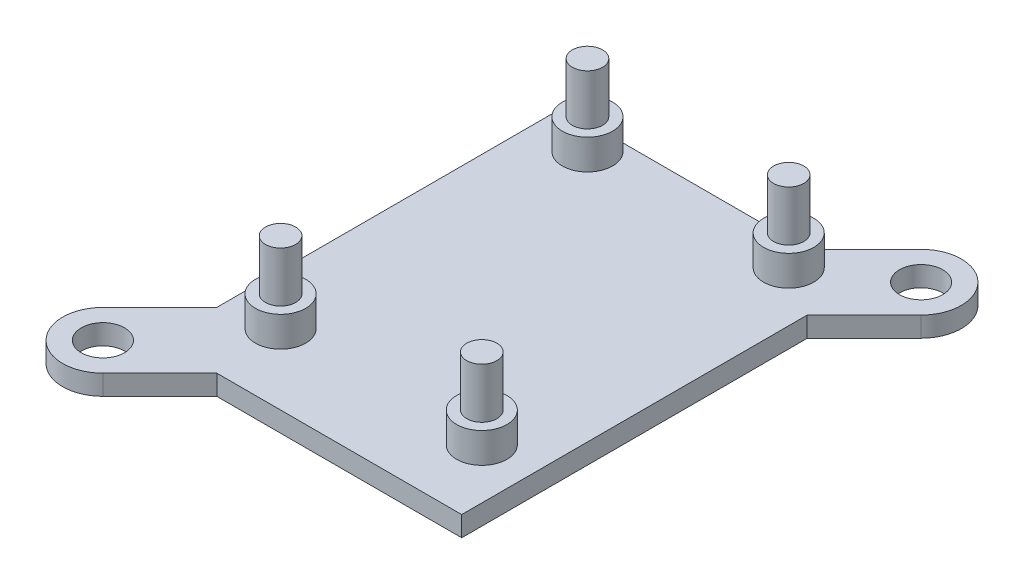
ISO-10303-21;
HEADER;
FILE_DESCRIPTION(('STEP AP214'),'2;1');
FILE_NAME('part.step','',(''),(''),'','','');
FILE_SCHEMA(('AUTOMOTIVE_DESIGN { 1 0 10303 214 1 1 1 1 }'));
ENDSEC;
DATA;
#1=APPLICATION_CONTEXT('core data for automotive mechanical design processes');
#2=APPLICATION_PROTOCOL_DEFINITION('international standard','automotive_design',2000,#1);
#3=PRODUCT_CONTEXT('',#1,'mechanical');
#4=PRODUCT('Part','Part','',(#3));
#5=PRODUCT_RELATED_PRODUCT_CATEGORY('part','',(#4));
#6=PRODUCT_DEFINITION_FORMATION('','',#4);
#7=PRODUCT_DEFINITION_CONTEXT('part definition',#1,'design');
#8=PRODUCT_DEFINITION('design','',#6,#7);
#9=PRODUCT_DEFINITION_SHAPE('','',#8);
#10=(LENGTH_UNIT() NAMED_UNIT(*) SI_UNIT(.MILLI.,.METRE.));
#11=(NAMED_UNIT(*) PLANE_ANGLE_UNIT() SI_UNIT($,.RADIAN.));
#12=(NAMED_UNIT(*) SI_UNIT($,.STERADIAN.) SOLID_ANGLE_UNIT());
#13=UNCERTAINTY_MEASURE_WITH_UNIT(LENGTH_MEASURE(1.E-05),#10,'distance_accuracy_value','');
#14=(GEOMETRIC_REPRESENTATION_CONTEXT(3) GLOBAL_UNCERTAINTY_ASSIGNED_CONTEXT((#13)) GLOBAL_UNIT_ASSIGNED_CONTEXT((#10,
#11,#12)) REPRESENTATION_CONTEXT('',''));
#15=CARTESIAN_POINT('',(0.,0.,0.));
#16=DIRECTION('',(0.,0.,1.));
#17=DIRECTION('',(1.,0.,0.));
#18=AXIS2_PLACEMENT_3D('',#15,#16,#17);
#19=CARTESIAN_POINT('',(0.,2.,0.));
#20=DIRECTION('',(-1.,0.,0.));
#21=DIRECTION('',(0.,0.,1.));
#22=AXIS2_PLACEMENT_3D('',#19,#20,#21);
#23=PLANE('',#22);
#24=DIRECTION('',(0.,0.,-1.));
#25=VECTOR('',#24,1.);
#26=CARTESIAN_POINT('',(0.,0.,0.));
#27=LINE('',#26,#25);
#28=CARTESIAN_POINT('',(0.,0.,34.3431457505076));
#29=VERTEX_POINT('',#28);
#30=CARTESIAN_POINT('',(0.,0.,0.));
#31=VERTEX_POINT('',#30);
#32=EDGE_CURVE('E180',#29,#31,#27,.T.);
#33=ORIENTED_EDGE('',*,*,#32,.F.);
#34=DIRECTION('',(0.,-1.,0.));
#35=VECTOR('',#34,1.);
#36=CARTESIAN_POINT('',(0.,2.,34.3431457505076));
#37=LINE('',#36,#35);
#38=CARTESIAN_POINT('',(0.,2.,34.3431457505076));
#39=VERTEX_POINT('',#38);
#40=EDGE_CURVE('E11',#39,#29,#37,.T.);
#41=ORIENTED_EDGE('',*,*,#40,.F.);
#42=DIRECTION('',(0.,0.,-1.));
#43=VECTOR('',#42,1.);
#44=CARTESIAN_POINT('',(0.,2.,0.));
#45=LINE('',#44,#43);
#46=CARTESIAN_POINT('',(0.,2.,0.));
#47=VERTEX_POINT('',#46);
#48=EDGE_CURVE('E223',#39,#47,#45,.T.);
#49=ORIENTED_EDGE('',*,*,#48,.T.);
#50=DIRECTION('',(0.,-1.,0.));
#51=VECTOR('',#50,1.);
#52=CARTESIAN_POINT('',(0.,2.,0.));
#53=LINE('',#52,#51);
#54=EDGE_CURVE('E70',#47,#31,#53,.T.);
#55=ORIENTED_EDGE('',*,*,#54,.T.);
#56=EDGE_LOOP('',(#33,#41,#49,#55));
#57=FACE_BOUND('',#56,.T.);
#58=ADVANCED_FACE('F47',(#57),#23,.T.);
#59=CARTESIAN_POINT('',(17.1715728752538,2.,17.1715728752535));
#60=DIRECTION('',(-0.707106781186552,0.,-0.707106781186543));
#61=DIRECTION('',(-0.707106781186543,0.,0.707106781186552));
#62=AXIS2_PLACEMENT_3D('',#59,#60,#61);
#63=PLANE('',#62);
#64=DIRECTION('',(0.707106781186543,0.,-0.707106781186552));
#65=VECTOR('',#64,1.);
#66=CARTESIAN_POINT('',(17.1715728752538,0.,17.1715728752535));
#67=LINE('',#66,#65);
#68=CARTESIAN_POINT('',(-5.65685424949238,0.,40.));
#69=VERTEX_POINT('',#68);
#70=EDGE_CURVE('E183',#69,#29,#67,.T.);
#71=ORIENTED_EDGE('',*,*,#70,.F.);
#72=DIRECTION('',(0.,-1.,0.));
#73=VECTOR('',#72,1.);
#74=CARTESIAN_POINT('',(-5.65685424949238,2.,40.));
#75=LINE('',#74,#73);
#76=CARTESIAN_POINT('',(-5.65685424949238,2.,40.));
#77=VERTEX_POINT('',#76);
#78=EDGE_CURVE('E56',#77,#69,#75,.T.);
#79=ORIENTED_EDGE('',*,*,#78,.F.);
#80=DIRECTION('',(0.707106781186543,0.,-0.707106781186552));
#81=VECTOR('',#80,1.);
#82=CARTESIAN_POINT('',(17.1715728752538,2.,17.1715728752535));
#83=LINE('',#82,#81);
#84=EDGE_CURVE('E297',#77,#39,#83,.T.);
#85=ORIENTED_EDGE('',*,*,#84,.T.);
#86=ORIENTED_EDGE('',*,*,#40,.T.);
#87=EDGE_LOOP('',(#71,#79,#85,#86));
#88=FACE_BOUND('',#87,.T.);
#89=ADVANCED_FACE('F328',(#88),#63,.T.);
#90=CARTESIAN_POINT('',(-2.82842712474619,2.,42.8284271247462));
#91=DIRECTION('',(0.,-1.,0.));
#92=DIRECTION('',(0.,0.,-1.));
#93=AXIS2_PLACEMENT_3D('',#90,#91,#92);
#94=CYLINDRICAL_SURFACE('',#93,4.);
#95=CARTESIAN_POINT('',(-2.82842712474619,0.,42.8284271247462));
#96=DIRECTION('',(0.,1.,0.));
#97=DIRECTION('',(0.,0.,1.));
#98=AXIS2_PLACEMENT_3D('',#95,#96,#97);
#99=CIRCLE('',#98,4.);
#100=CARTESIAN_POINT('',(0.,0.,45.6568542494924));
#101=VERTEX_POINT('',#100);
#102=EDGE_CURVE('E188',#69,#101,#99,.T.);
#103=ORIENTED_EDGE('',*,*,#102,.T.);
#104=DIRECTION('',(0.,-1.,0.));
#105=VECTOR('',#104,1.);
#106=CARTESIAN_POINT('',(0.,2.,45.6568542494924));
#107=LINE('',#106,#105);
#108=CARTESIAN_POINT('',(0.,2.,45.6568542494924));
#109=VERTEX_POINT('',#108);
#110=EDGE_CURVE('E239',#109,#101,#107,.T.);
#111=ORIENTED_EDGE('',*,*,#110,.F.);
#112=CARTESIAN_POINT('',(-2.82842712474619,2.,42.8284271247462));
#113=DIRECTION('',(0.,1.,0.));
#114=DIRECTION('',(0.,0.,1.));
#115=AXIS2_PLACEMENT_3D('',#112,#113,#114);
#116=CIRCLE('',#115,4.);
#117=EDGE_CURVE('E301',#77,#109,#116,.T.);
#118=ORIENTED_EDGE('',*,*,#117,.F.);
#119=ORIENTED_EDGE('',*,*,#78,.T.);
#120=EDGE_LOOP('',(#103,#111,#118,#119));
#121=FACE_BOUND('',#120,.T.);
#122=ADVANCED_FACE('F333',(#121),#94,.T.);
#123=CARTESIAN_POINT('',(22.8284271247462,2.,22.8284271247463));
#124=DIRECTION('',(-0.707106781186546,0.,-0.707106781186549));
#125=DIRECTION('',(-0.707106781186549,0.,0.707106781186546));
#126=AXIS2_PLACEMENT_3D('',#123,#124,#125);
#127=PLANE('',#126);
#128=DIRECTION('',(0.707106781186549,0.,-0.707106781186546));
#129=VECTOR('',#128,1.);
#130=CARTESIAN_POINT('',(22.8284271247462,0.,22.8284271247463));
#131=LINE('',#130,#129);
#132=CARTESIAN_POINT('',(5.65685424949242,0.,40.));
#133=VERTEX_POINT('',#132);
#134=EDGE_CURVE('E191',#101,#133,#131,.T.);
#135=ORIENTED_EDGE('',*,*,#134,.T.);
#136=DIRECTION('',(0.,-1.,0.));
#137=VECTOR('',#136,1.);
#138=CARTESIAN_POINT('',(5.65685424949242,2.,40.));
#139=LINE('',#138,#137);
#140=CARTESIAN_POINT('',(5.65685424949242,2.,40.));
#141=VERTEX_POINT('',#140);
#142=EDGE_CURVE('E236',#141,#133,#139,.T.);
#143=ORIENTED_EDGE('',*,*,#142,.F.);
#144=DIRECTION('',(0.707106781186549,0.,-0.707106781186546));
#145=VECTOR('',#144,1.);
#146=CARTESIAN_POINT('',(22.8284271247462,2.,22.8284271247463));
#147=LINE('',#146,#145);
#148=EDGE_CURVE('E304',#109,#141,#147,.T.);
#149=ORIENTED_EDGE('',*,*,#148,.F.);
#150=ORIENTED_EDGE('',*,*,#110,.T.);
#151=EDGE_LOOP('',(#135,#143,#149,#150));
#152=FACE_BOUND('',#151,.T.);
#153=ADVANCED_FACE('F337',(#152),#127,.F.);
#154=CARTESIAN_POINT('',(0.,2.,40.));
#155=DIRECTION('',(0.,0.,1.));
#156=DIRECTION('',(1.,0.,0.));
#157=AXIS2_PLACEMENT_3D('',#154,#155,#156);
#158=PLANE('',#157);
#159=DIRECTION('',(-1.,0.,0.));
#160=VECTOR('',#159,1.);
#161=CARTESIAN_POINT('',(0.,0.,40.));
#162=LINE('',#161,#160);
#163=CARTESIAN_POINT('',(30.,0.,40.));
#164=VERTEX_POINT('',#163);
#165=EDGE_CURVE('E195',#164,#133,#162,.T.);
#166=ORIENTED_EDGE('',*,*,#165,.F.);
#167=DIRECTION('',(0.,-1.,0.));
#168=VECTOR('',#167,1.);
#169=CARTESIAN_POINT('',(30.,2.,40.));
#170=LINE('',#169,#168);
#171=CARTESIAN_POINT('',(30.,2.,40.));
#172=VERTEX_POINT('',#171);
#173=EDGE_CURVE('E233',#172,#164,#170,.T.);
#174=ORIENTED_EDGE('',*,*,#173,.F.);
#175=DIRECTION('',(-1.,0.,0.));
#176=VECTOR('',#175,1.);
#177=CARTESIAN_POINT('',(0.,2.,40.));
#178=LINE('',#177,#176);
#179=EDGE_CURVE('E307',#172,#141,#178,.T.);
#180=ORIENTED_EDGE('',*,*,#179,.T.);
#181=ORIENTED_EDGE('',*,*,#142,.T.);
#182=EDGE_LOOP('',(#166,#174,#180,#181));
#183=FACE_BOUND('',#182,.T.);
#184=ADVANCED_FACE('F340',(#183),#158,.T.);
#185=CARTESIAN_POINT('',(30.,2.,0.));
#186=DIRECTION('',(1.,0.,0.));
#187=DIRECTION('',(0.,0.,-1.));
#188=AXIS2_PLACEMENT_3D('',#185,#186,#187);
#189=PLANE('',#188);
#190=DIRECTION('',(0.,0.,1.));
#191=VECTOR('',#190,1.);
#192=CARTESIAN_POINT('',(30.,0.,0.));
#193=LINE('',#192,#191);
#194=CARTESIAN_POINT('',(30.,0.,5.6568542494922));
#195=VERTEX_POINT('',#194);
#196=EDGE_CURVE('E199',#195,#164,#193,.T.);
#197=ORIENTED_EDGE('',*,*,#196,.F.);
#198=DIRECTION('',(0.,-1.,0.));
#199=VECTOR('',#198,1.);
#200=CARTESIAN_POINT('',(30.,2.,5.6568542494922));
#201=LINE('',#200,#199);
#202=CARTESIAN_POINT('',(30.,2.,5.6568542494922));
#203=VERTEX_POINT('',#202);
#204=EDGE_CURVE('E230',#203,#195,#201,.T.);
#205=ORIENTED_EDGE('',*,*,#204,.F.);
#206=DIRECTION('',(0.,0.,1.));
#207=VECTOR('',#206,1.);
#208=CARTESIAN_POINT('',(30.,2.,0.));
#209=LINE('',#208,#207);
#210=EDGE_CURVE('E165',#203,#172,#209,.T.);
#211=ORIENTED_EDGE('',*,*,#210,.T.);
#212=ORIENTED_EDGE('',*,*,#173,.T.);
#213=EDGE_LOOP('',(#197,#205,#211,#212));
#214=FACE_BOUND('',#213,.T.);
#215=ADVANCED_FACE('F314',(#214),#189,.T.);
#216=CARTESIAN_POINT('',(17.8284271247457,2.,17.8284271247462));
#217=DIRECTION('',(0.707106781186537,0.,0.707106781186558));
#218=DIRECTION('',(0.707106781186558,0.,-0.707106781186537));
#219=AXIS2_PLACEMENT_3D('',#216,#217,#218);
#220=PLANE('',#219);
#221=DIRECTION('',(-0.707106781186558,0.,0.707106781186537));
#222=VECTOR('',#221,1.);
#223=CARTESIAN_POINT('',(17.8284271247457,0.,17.8284271247462));
#224=LINE('',#223,#222);
#225=CARTESIAN_POINT('',(35.6568542494924,0.,0.));
#226=VERTEX_POINT('',#225);
#227=EDGE_CURVE('E203',#226,#195,#224,.T.);
#228=ORIENTED_EDGE('',*,*,#227,.F.);
#229=DIRECTION('',(0.,-1.,0.));
#230=VECTOR('',#229,1.);
#231=CARTESIAN_POINT('',(35.6568542494924,2.,0.));
#232=LINE('',#231,#230);
#233=CARTESIAN_POINT('',(35.6568542494924,2.,0.));
#234=VERTEX_POINT('',#233);
#235=EDGE_CURVE('E143',#234,#226,#232,.T.);
#236=ORIENTED_EDGE('',*,*,#235,.F.);
#237=DIRECTION('',(-0.707106781186558,0.,0.707106781186537));
#238=VECTOR('',#237,1.);
#239=CARTESIAN_POINT('',(17.8284271247457,2.,17.8284271247462));
#240=LINE('',#239,#238);
#241=EDGE_CURVE('E161',#234,#203,#240,.T.);
#242=ORIENTED_EDGE('',*,*,#241,.T.);
#243=ORIENTED_EDGE('',*,*,#204,.T.);
#244=EDGE_LOOP('',(#228,#236,#242,#243));
#245=FACE_BOUND('',#244,.T.);
#246=ADVANCED_FACE('F319',(#245),#220,.T.);
#247=CARTESIAN_POINT('',(32.8284271247462,2.,-2.82842712474619));
#248=DIRECTION('',(0.,-1.,0.));
#249=DIRECTION('',(0.,0.,-1.));
#250=AXIS2_PLACEMENT_3D('',#247,#248,#249);
#251=CYLINDRICAL_SURFACE('',#250,4.);
#252=CARTESIAN_POINT('',(32.8284271247462,0.,-2.82842712474619));
#253=DIRECTION('',(0.,1.,0.));
#254=DIRECTION('',(0.,0.,1.));
#255=AXIS2_PLACEMENT_3D('',#252,#253,#254);
#256=CIRCLE('',#255,4.);
#257=CARTESIAN_POINT('',(30.,0.,-5.65685424949238));
#258=VERTEX_POINT('',#257);
#259=EDGE_CURVE('E138',#258,#226,#256,.F.);
#260=ORIENTED_EDGE('',*,*,#259,.F.);
#261=DIRECTION('',(0.,-1.,0.));
#262=VECTOR('',#261,1.);
#263=CARTESIAN_POINT('',(30.,2.,-5.65685424949238));
#264=LINE('',#263,#262);
#265=CARTESIAN_POINT('',(30.,2.,-5.65685424949238));
#266=VERTEX_POINT('',#265);
#267=EDGE_CURVE('E132',#266,#258,#264,.T.);
#268=ORIENTED_EDGE('',*,*,#267,.F.);
#269=CARTESIAN_POINT('',(32.8284271247462,2.,-2.82842712474619));
#270=DIRECTION('',(0.,1.,0.));
#271=DIRECTION('',(0.,0.,1.));
#272=AXIS2_PLACEMENT_3D('',#269,#270,#271);
#273=CIRCLE('',#272,4.);
#274=EDGE_CURVE('E136',#266,#234,#273,.F.);
#275=ORIENTED_EDGE('',*,*,#274,.T.);
#276=ORIENTED_EDGE('',*,*,#235,.T.);
#277=EDGE_LOOP('',(#260,#268,#275,#276));
#278=FACE_BOUND('',#277,.T.);
#279=ADVANCED_FACE('F134',(#278),#251,.T.);
#280=CARTESIAN_POINT('',(12.171572875254,2.,12.1715728752539));
#281=DIRECTION('',(0.707106781186553,0.,0.707106781186542));
#282=DIRECTION('',(0.707106781186542,0.,-0.707106781186553));
#283=AXIS2_PLACEMENT_3D('',#280,#281,#282);
#284=PLANE('',#283);
#285=DIRECTION('',(-0.707106781186542,0.,0.707106781186553));
#286=VECTOR('',#285,1.);
#287=CARTESIAN_POINT('',(12.171572875254,0.,12.1715728752539));
#288=LINE('',#287,#286);
#289=CARTESIAN_POINT('',(24.3431457505077,0.,0.));
#290=VERTEX_POINT('',#289);
#291=EDGE_CURVE('E209',#258,#290,#288,.T.);
#292=ORIENTED_EDGE('',*,*,#291,.T.);
#293=DIRECTION('',(0.,-1.,0.));
#294=VECTOR('',#293,1.);
#295=CARTESIAN_POINT('',(24.3431457505077,2.,0.));
#296=LINE('',#295,#294);
#297=CARTESIAN_POINT('',(24.3431457505077,2.,0.));
#298=VERTEX_POINT('',#297);
#299=EDGE_CURVE('E144',#298,#290,#296,.T.);
#300=ORIENTED_EDGE('',*,*,#299,.F.);
#301=DIRECTION('',(-0.707106781186542,0.,0.707106781186553));
#302=VECTOR('',#301,1.);
#303=CARTESIAN_POINT('',(12.171572875254,2.,12.1715728752539));
#304=LINE('',#303,#302);
#305=EDGE_CURVE('E148',#266,#298,#304,.T.);
#306=ORIENTED_EDGE('',*,*,#305,.F.);
#307=ORIENTED_EDGE('',*,*,#267,.T.);
#308=EDGE_LOOP('',(#292,#300,#306,#307));
#309=FACE_BOUND('',#308,.T.);
#310=ADVANCED_FACE('F149',(#309),#284,.F.);
#311=CARTESIAN_POINT('',(32.8284271247462,2.,-2.82842712474619));
#312=DIRECTION('',(0.,-1.,0.));
#313=DIRECTION('',(0.,0.,-1.));
#314=AXIS2_PLACEMENT_3D('',#311,#312,#313);
#315=CYLINDRICAL_SURFACE('',#314,2.15);
#316=CARTESIAN_POINT('',(32.8284271247462,2.,-2.82842712474619));
#317=DIRECTION('',(0.,1.,0.));
#318=DIRECTION('',(0.,0.,1.));
#319=AXIS2_PLACEMENT_3D('',#316,#317,#318);
#320=CIRCLE('',#319,2.15);
#321=CARTESIAN_POINT('',(32.8284271247462,2.,-0.678427124746188));
#322=VERTEX_POINT('',#321);
#323=EDGE_CURVE('E172',#322,#322,#320,.T.);
#324=ORIENTED_EDGE('',*,*,#323,.T.);
#325=EDGE_LOOP('',(#324));
#326=FACE_BOUND('',#325,.T.);
#327=CARTESIAN_POINT('',(32.8284271247462,0.,-2.82842712474619));
#328=DIRECTION('',(0.,1.,0.));
#329=DIRECTION('',(0.,0.,1.));
#330=AXIS2_PLACEMENT_3D('',#327,#328,#329);
#331=CIRCLE('',#330,2.15);
#332=CARTESIAN_POINT('',(32.8284271247462,0.,-0.678427124746188));
#333=VERTEX_POINT('',#332);
#334=EDGE_CURVE('E215',#333,#333,#331,.T.);
#335=ORIENTED_EDGE('',*,*,#334,.F.);
#336=EDGE_LOOP('',(#335));
#337=FACE_BOUND('',#336,.T.);
#338=ADVANCED_FACE('F400',(#326,#337),#315,.F.);
#339=CARTESIAN_POINT('',(0.,2.,0.));
#340=DIRECTION('',(0.,0.,-1.));
#341=DIRECTION('',(-1.,0.,0.));
#342=AXIS2_PLACEMENT_3D('',#339,#340,#341);
#343=PLANE('',#342);
#344=DIRECTION('',(1.,0.,0.));
#345=VECTOR('',#344,1.);
#346=CARTESIAN_POINT('',(0.,2.,0.));
#347=LINE('',#346,#345);
#348=CARTESIAN_POINT('',(5.,2.,0.));
#349=VERTEX_POINT('',#348);
#350=EDGE_CURVE('E169',#47,#349,#347,.T.);
#351=ORIENTED_EDGE('',*,*,#350,.T.);
#352=EDGE_CURVE('E154',#349,#298,#347,.T.);
#353=ORIENTED_EDGE('',*,*,#352,.T.);
#354=ORIENTED_EDGE('',*,*,#299,.T.);
#355=DIRECTION('',(1.,0.,0.));
#356=VECTOR('',#355,1.);
#357=CARTESIAN_POINT('',(0.,0.,0.));
#358=LINE('',#357,#356);
#359=EDGE_CURVE('E212',#31,#290,#358,.T.);
#360=ORIENTED_EDGE('',*,*,#359,.F.);
#361=ORIENTED_EDGE('',*,*,#54,.F.);
#362=EDGE_LOOP('',(#351,#353,#354,#360,#361));
#363=FACE_BOUND('',#362,.T.);
#364=ADVANCED_FACE('F323',(#363),#343,.T.);
#365=CARTESIAN_POINT('',(-2.82842712474619,2.,42.8284271247462));
#366=DIRECTION('',(0.,-1.,0.));
#367=DIRECTION('',(0.,0.,-1.));
#368=AXIS2_PLACEMENT_3D('',#365,#366,#367);
#369=CYLINDRICAL_SURFACE('',#368,2.15);
#370=CARTESIAN_POINT('',(-2.82842712474619,2.,42.8284271247462));
#371=DIRECTION('',(0.,1.,0.));
#372=DIRECTION('',(0.,0.,1.));
#373=AXIS2_PLACEMENT_3D('',#370,#371,#372);
#374=CIRCLE('',#373,2.15);
#375=CARTESIAN_POINT('',(-2.82842712474619,2.,44.9784271247462));
#376=VERTEX_POINT('',#375);
#377=EDGE_CURVE('E176',#376,#376,#374,.T.);
#378=ORIENTED_EDGE('',*,*,#377,.T.);
#379=EDGE_LOOP('',(#378));
#380=FACE_BOUND('',#379,.T.);
#381=CARTESIAN_POINT('',(-2.82842712474619,0.,42.8284271247462));
#382=DIRECTION('',(0.,1.,0.));
#383=DIRECTION('',(0.,0.,1.));
#384=AXIS2_PLACEMENT_3D('',#381,#382,#383);
#385=CIRCLE('',#384,2.15);
#386=CARTESIAN_POINT('',(-2.82842712474619,0.,44.9784271247462));
#387=VERTEX_POINT('',#386);
#388=EDGE_CURVE('E219',#387,#387,#385,.T.);
#389=ORIENTED_EDGE('',*,*,#388,.F.);
#390=EDGE_LOOP('',(#389));
#391=FACE_BOUND('',#390,.T.);
#392=ADVANCED_FACE('F419',(#380,#391),#369,.F.);
#393=CARTESIAN_POINT('',(0.,2.,0.));
#394=DIRECTION('',(0.,1.,0.));
#395=DIRECTION('',(0.,0.,1.));
#396=AXIS2_PLACEMENT_3D('',#393,#394,#395);
#397=PLANE('',#396);
#398=CARTESIAN_POINT('',(5.,2.,33.));
#399=DIRECTION('',(0.,1.,0.));
#400=DIRECTION('',(0.,0.,1.));
#401=AXIS2_PLACEMENT_3D('',#398,#399,#400);
#402=CIRCLE('',#401,2.5);
#403=CARTESIAN_POINT('',(5.,2.,35.5));
#404=VERTEX_POINT('',#403);
#405=EDGE_CURVE('E276',#404,#404,#402,.F.);
#406=ORIENTED_EDGE('',*,*,#405,.T.);
#407=EDGE_LOOP('',(#406));
#408=FACE_BOUND('',#407,.T.);
#409=CARTESIAN_POINT('',(25.,2.,33.));
#410=DIRECTION('',(0.,1.,0.));
#411=DIRECTION('',(0.,0.,1.));
#412=AXIS2_PLACEMENT_3D('',#409,#410,#411);
#413=CIRCLE('',#412,2.5);
#414=CARTESIAN_POINT('',(25.,2.,35.5));
#415=VERTEX_POINT('',#414);
#416=EDGE_CURVE('E268',#415,#415,#413,.F.);
#417=ORIENTED_EDGE('',*,*,#416,.T.);
#418=EDGE_LOOP('',(#417));
#419=FACE_BOUND('',#418,.T.);
#420=CARTESIAN_POINT('',(25.,2.,2.5));
#421=DIRECTION('',(0.,1.,0.));
#422=DIRECTION('',(0.,0.,1.));
#423=AXIS2_PLACEMENT_3D('',#420,#421,#422);
#424=CIRCLE('',#423,2.5);
#425=CARTESIAN_POINT('',(25.,2.,5.));
#426=VERTEX_POINT('',#425);
#427=EDGE_CURVE('E263',#426,#426,#424,.F.);
#428=ORIENTED_EDGE('',*,*,#427,.T.);
#429=EDGE_LOOP('',(#428));
#430=FACE_BOUND('',#429,.T.);
#431=ORIENTED_EDGE('',*,*,#352,.F.);
#432=CARTESIAN_POINT('',(5.,2.,2.5));
#433=DIRECTION('',(0.,1.,0.));
#434=DIRECTION('',(0.,0.,1.));
#435=AXIS2_PLACEMENT_3D('',#432,#433,#434);
#436=CIRCLE('',#435,2.5);
#437=EDGE_CURVE('E62',#349,#349,#436,.F.);
#438=ORIENTED_EDGE('',*,*,#437,.T.);
#439=ORIENTED_EDGE('',*,*,#350,.F.);
#440=ORIENTED_EDGE('',*,*,#48,.F.);
#441=ORIENTED_EDGE('',*,*,#84,.F.);
#442=ORIENTED_EDGE('',*,*,#117,.T.);
#443=ORIENTED_EDGE('',*,*,#148,.T.);
#444=ORIENTED_EDGE('',*,*,#179,.F.);
#445=ORIENTED_EDGE('',*,*,#210,.F.);
#446=ORIENTED_EDGE('',*,*,#241,.F.);
#447=ORIENTED_EDGE('',*,*,#274,.F.);
#448=ORIENTED_EDGE('',*,*,#305,.T.);
#449=EDGE_LOOP('',(#431,#438,#439,#440,#441,#442,#443,#444,#445,#446,#447,#448));
#450=FACE_BOUND('',#449,.T.);
#451=ORIENTED_EDGE('',*,*,#323,.F.);
#452=EDGE_LOOP('',(#451));
#453=FACE_BOUND('',#452,.T.);
#454=ORIENTED_EDGE('',*,*,#377,.F.);
#455=EDGE_LOOP('',(#454));
#456=FACE_BOUND('',#455,.T.);
#457=ADVANCED_FACE('F157',(#408,#419,#430,#450,#453,#456),#397,.T.);
#458=CARTESIAN_POINT('',(0.,0.,0.));
#459=DIRECTION('',(0.,1.,0.));
#460=DIRECTION('',(0.,0.,1.));
#461=AXIS2_PLACEMENT_3D('',#458,#459,#460);
#462=PLANE('',#461);
#463=ORIENTED_EDGE('',*,*,#359,.T.);
#464=ORIENTED_EDGE('',*,*,#291,.F.);
#465=ORIENTED_EDGE('',*,*,#259,.T.);
#466=ORIENTED_EDGE('',*,*,#227,.T.);
#467=ORIENTED_EDGE('',*,*,#196,.T.);
#468=ORIENTED_EDGE('',*,*,#165,.T.);
#469=ORIENTED_EDGE('',*,*,#134,.F.);
#470=ORIENTED_EDGE('',*,*,#102,.F.);
#471=ORIENTED_EDGE('',*,*,#70,.T.);
#472=ORIENTED_EDGE('',*,*,#32,.T.);
#473=EDGE_LOOP('',(#463,#464,#465,#466,#467,#468,#469,#470,#471,#472));
#474=FACE_BOUND('',#473,.T.);
#475=ORIENTED_EDGE('',*,*,#334,.T.);
#476=EDGE_LOOP('',(#475));
#477=FACE_BOUND('',#476,.T.);
#478=ORIENTED_EDGE('',*,*,#388,.T.);
#479=EDGE_LOOP('',(#478));
#480=FACE_BOUND('',#479,.T.);
#481=ADVANCED_FACE('F321',(#474,#477,#480),#462,.F.);
#482=CARTESIAN_POINT('',(25.,5.,2.5));
#483=DIRECTION('',(0.,-1.,0.));
#484=DIRECTION('',(0.,0.,-1.));
#485=AXIS2_PLACEMENT_3D('',#482,#483,#484);
#486=CYLINDRICAL_SURFACE('',#485,2.5);
#487=ORIENTED_EDGE('',*,*,#427,.F.);
#488=EDGE_LOOP('',(#487));
#489=FACE_BOUND('',#488,.T.);
#490=CARTESIAN_POINT('',(25.,5.,2.5));
#491=DIRECTION('',(0.,1.,0.));
#492=DIRECTION('',(0.,0.,1.));
#493=AXIS2_PLACEMENT_3D('',#490,#491,#492);
#494=CIRCLE('',#493,2.5);
#495=CARTESIAN_POINT('',(25.,5.,5.));
#496=VERTEX_POINT('',#495);
#497=EDGE_CURVE('E621',#496,#496,#494,.T.);
#498=ORIENTED_EDGE('',*,*,#497,.F.);
#499=EDGE_LOOP('',(#498));
#500=FACE_BOUND('',#499,.T.);
#501=ADVANCED_FACE('F453',(#489,#500),#486,.T.);
#502=CARTESIAN_POINT('',(25.,5.,2.5));
#503=DIRECTION('',(0.,1.,0.));
#504=DIRECTION('',(0.,0.,1.));
#505=AXIS2_PLACEMENT_3D('',#502,#503,#504);
#506=PLANE('',#505);
#507=CARTESIAN_POINT('',(25.,5.,2.5));
#508=DIRECTION('',(0.,1.,0.));
#509=DIRECTION('',(0.,0.,1.));
#510=AXIS2_PLACEMENT_3D('',#507,#508,#509);
#511=CIRCLE('',#510,1.5);
#512=CARTESIAN_POINT('',(25.,5.,4.));
#513=VERTEX_POINT('',#512);
#514=EDGE_CURVE('E245',#513,#513,#511,.T.);
#515=ORIENTED_EDGE('',*,*,#514,.F.);
#516=EDGE_LOOP('',(#515));
#517=FACE_BOUND('',#516,.T.);
#518=ORIENTED_EDGE('',*,*,#497,.T.);
#519=EDGE_LOOP('',(#518));
#520=FACE_BOUND('',#519,.T.);
#521=ADVANCED_FACE('F546',(#517,#520),#506,.T.);
#522=CARTESIAN_POINT('',(25.,5.,33.));
#523=DIRECTION('',(0.,-1.,0.));
#524=DIRECTION('',(0.,0.,-1.));
#525=AXIS2_PLACEMENT_3D('',#522,#523,#524);
#526=CYLINDRICAL_SURFACE('',#525,2.5);
#527=ORIENTED_EDGE('',*,*,#416,.F.);
#528=EDGE_LOOP('',(#527));
#529=FACE_BOUND('',#528,.T.);
#530=CARTESIAN_POINT('',(25.,5.,33.));
#531=DIRECTION('',(0.,1.,0.));
#532=DIRECTION('',(0.,0.,1.));
#533=AXIS2_PLACEMENT_3D('',#530,#531,#532);
#534=CIRCLE('',#533,2.5);
#535=CARTESIAN_POINT('',(25.,5.,35.5));
#536=VERTEX_POINT('',#535);
#537=EDGE_CURVE('E624',#536,#536,#534,.T.);
#538=ORIENTED_EDGE('',*,*,#537,.F.);
#539=EDGE_LOOP('',(#538));
#540=FACE_BOUND('',#539,.T.);
#541=ADVANCED_FACE('F556',(#529,#540),#526,.T.);
#542=CARTESIAN_POINT('',(25.,5.,33.));
#543=DIRECTION('',(0.,1.,0.));
#544=DIRECTION('',(0.,0.,1.));
#545=AXIS2_PLACEMENT_3D('',#542,#543,#544);
#546=PLANE('',#545);
#547=CARTESIAN_POINT('',(25.,5.,33.));
#548=DIRECTION('',(0.,1.,0.));
#549=DIRECTION('',(0.,0.,1.));
#550=AXIS2_PLACEMENT_3D('',#547,#548,#549);
#551=CIRCLE('',#550,1.5);
#552=CARTESIAN_POINT('',(25.,5.,34.5));
#553=VERTEX_POINT('',#552);
#554=EDGE_CURVE('E249',#553,#553,#551,.T.);
#555=ORIENTED_EDGE('',*,*,#554,.F.);
#556=EDGE_LOOP('',(#555));
#557=FACE_BOUND('',#556,.T.);
#558=ORIENTED_EDGE('',*,*,#537,.T.);
#559=EDGE_LOOP('',(#558));
#560=FACE_BOUND('',#559,.T.);
#561=ADVANCED_FACE('F566',(#557,#560),#546,.T.);
#562=CARTESIAN_POINT('',(5.,5.,33.));
#563=DIRECTION('',(0.,-1.,0.));
#564=DIRECTION('',(0.,0.,-1.));
#565=AXIS2_PLACEMENT_3D('',#562,#563,#564);
#566=CYLINDRICAL_SURFACE('',#565,2.5);
#567=ORIENTED_EDGE('',*,*,#405,.F.);
#568=EDGE_LOOP('',(#567));
#569=FACE_BOUND('',#568,.T.);
#570=CARTESIAN_POINT('',(5.,5.,33.));
#571=DIRECTION('',(0.,1.,0.));
#572=DIRECTION('',(0.,0.,1.));
#573=AXIS2_PLACEMENT_3D('',#570,#571,#572);
#574=CIRCLE('',#573,2.5);
#575=CARTESIAN_POINT('',(5.,5.,35.5));
#576=VERTEX_POINT('',#575);
#577=EDGE_CURVE('E630',#576,#576,#574,.T.);
#578=ORIENTED_EDGE('',*,*,#577,.F.);
#579=EDGE_LOOP('',(#578));
#580=FACE_BOUND('',#579,.T.);
#581=ADVANCED_FACE('F576',(#569,#580),#566,.T.);
#582=CARTESIAN_POINT('',(5.,5.,33.));
#583=DIRECTION('',(0.,1.,0.));
#584=DIRECTION('',(0.,0.,1.));
#585=AXIS2_PLACEMENT_3D('',#582,#583,#584);
#586=PLANE('',#585);
#587=CARTESIAN_POINT('',(5.,5.,33.));
#588=DIRECTION('',(0.,1.,0.));
#589=DIRECTION('',(0.,0.,1.));
#590=AXIS2_PLACEMENT_3D('',#587,#588,#589);
#591=CIRCLE('',#590,1.5);
#592=CARTESIAN_POINT('',(5.,5.,34.5));
#593=VERTEX_POINT('',#592);
#594=EDGE_CURVE('E253',#593,#593,#591,.T.);
#595=ORIENTED_EDGE('',*,*,#594,.F.);
#596=EDGE_LOOP('',(#595));
#597=FACE_BOUND('',#596,.T.);
#598=ORIENTED_EDGE('',*,*,#577,.T.);
#599=EDGE_LOOP('',(#598));
#600=FACE_BOUND('',#599,.T.);
#601=ADVANCED_FACE('F586',(#597,#600),#586,.T.);
#602=CARTESIAN_POINT('',(5.,5.,2.5));
#603=DIRECTION('',(0.,-1.,0.));
#604=DIRECTION('',(0.,0.,-1.));
#605=AXIS2_PLACEMENT_3D('',#602,#603,#604);
#606=CYLINDRICAL_SURFACE('',#605,2.5);
#607=ORIENTED_EDGE('',*,*,#437,.F.);
#608=EDGE_LOOP('',(#607));
#609=FACE_BOUND('',#608,.T.);
#610=CARTESIAN_POINT('',(5.,5.,2.5));
#611=DIRECTION('',(0.,1.,0.));
#612=DIRECTION('',(0.,0.,1.));
#613=AXIS2_PLACEMENT_3D('',#610,#611,#612);
#614=CIRCLE('',#613,2.5);
#615=CARTESIAN_POINT('',(5.,5.,5.));
#616=VERTEX_POINT('',#615);
#617=EDGE_CURVE('E250',#616,#616,#614,.T.);
#618=ORIENTED_EDGE('',*,*,#617,.F.);
#619=EDGE_LOOP('',(#618));
#620=FACE_BOUND('',#619,.T.);
#621=ADVANCED_FACE('F596',(#609,#620),#606,.T.);
#622=CARTESIAN_POINT('',(5.,5.,2.5));
#623=DIRECTION('',(0.,1.,0.));
#624=DIRECTION('',(0.,0.,1.));
#625=AXIS2_PLACEMENT_3D('',#622,#623,#624);
#626=PLANE('',#625);
#627=CARTESIAN_POINT('',(5.,5.,2.5));
#628=DIRECTION('',(0.,1.,0.));
#629=DIRECTION('',(0.,0.,1.));
#630=AXIS2_PLACEMENT_3D('',#627,#628,#629);
#631=CIRCLE('',#630,1.5);
#632=CARTESIAN_POINT('',(5.,5.,4.));
#633=VERTEX_POINT('',#632);
#634=EDGE_CURVE('E50',#633,#633,#631,.T.);
#635=ORIENTED_EDGE('',*,*,#634,.F.);
#636=EDGE_LOOP('',(#635));
#637=FACE_BOUND('',#636,.T.);
#638=ORIENTED_EDGE('',*,*,#617,.T.);
#639=EDGE_LOOP('',(#638));
#640=FACE_BOUND('',#639,.T.);
#641=ADVANCED_FACE('F537',(#637,#640),#626,.T.);
#642=CARTESIAN_POINT('',(25.,10.,2.5));
#643=DIRECTION('',(0.,1.,0.));
#644=DIRECTION('',(0.,0.,1.));
#645=AXIS2_PLACEMENT_3D('',#642,#643,#644);
#646=PLANE('',#645);
#647=CARTESIAN_POINT('',(25.,10.,2.5));
#648=DIRECTION('',(0.,1.,0.));
#649=DIRECTION('',(0.,0.,1.));
#650=AXIS2_PLACEMENT_3D('',#647,#648,#649);
#651=CIRCLE('',#650,1.5);
#652=CARTESIAN_POINT('',(25.,10.,4.));
#653=VERTEX_POINT('',#652);
#654=EDGE_CURVE('E280',#653,#653,#651,.T.);
#655=ORIENTED_EDGE('',*,*,#654,.T.);
#656=EDGE_LOOP('',(#655));
#657=FACE_BOUND('',#656,.T.);
#658=ADVANCED_FACE('F527',(#657),#646,.T.);
#659=CARTESIAN_POINT('',(25.,10.,2.5));
#660=DIRECTION('',(0.,-1.,0.));
#661=DIRECTION('',(0.,0.,-1.));
#662=AXIS2_PLACEMENT_3D('',#659,#660,#661);
#663=CYLINDRICAL_SURFACE('',#662,1.5);
#664=ORIENTED_EDGE('',*,*,#514,.T.);
#665=EDGE_LOOP('',(#664));
#666=FACE_BOUND('',#665,.T.);
#667=ORIENTED_EDGE('',*,*,#654,.F.);
#668=EDGE_LOOP('',(#667));
#669=FACE_BOUND('',#668,.T.);
#670=ADVANCED_FACE('F518',(#666,#669),#663,.T.);
#671=CARTESIAN_POINT('',(25.,10.,33.));
#672=DIRECTION('',(0.,1.,0.));
#673=DIRECTION('',(0.,0.,1.));
#674=AXIS2_PLACEMENT_3D('',#671,#672,#673);
#675=PLANE('',#674);
#676=CARTESIAN_POINT('',(25.,10.,33.));
#677=DIRECTION('',(0.,1.,0.));
#678=DIRECTION('',(0.,0.,1.));
#679=AXIS2_PLACEMENT_3D('',#676,#677,#678);
#680=CIRCLE('',#679,1.5);
#681=CARTESIAN_POINT('',(25.,10.,34.5));
#682=VERTEX_POINT('',#681);
#683=EDGE_CURVE('E285',#682,#682,#680,.T.);
#684=ORIENTED_EDGE('',*,*,#683,.T.);
#685=EDGE_LOOP('',(#684));
#686=FACE_BOUND('',#685,.T.);
#687=ADVANCED_FACE('F508',(#686),#675,.T.);
#688=CARTESIAN_POINT('',(25.,10.,33.));
#689=DIRECTION('',(0.,-1.,0.));
#690=DIRECTION('',(0.,0.,-1.));
#691=AXIS2_PLACEMENT_3D('',#688,#689,#690);
#692=CYLINDRICAL_SURFACE('',#691,1.5);
#693=ORIENTED_EDGE('',*,*,#554,.T.);
#694=EDGE_LOOP('',(#693));
#695=FACE_BOUND('',#694,.T.);
#696=ORIENTED_EDGE('',*,*,#683,.F.);
#697=EDGE_LOOP('',(#696));
#698=FACE_BOUND('',#697,.T.);
#699=ADVANCED_FACE('F498',(#695,#698),#692,.T.);
#700=CARTESIAN_POINT('',(5.,10.,33.));
#701=DIRECTION('',(0.,1.,0.));
#702=DIRECTION('',(0.,0.,1.));
#703=AXIS2_PLACEMENT_3D('',#700,#701,#702);
#704=PLANE('',#703);
#705=CARTESIAN_POINT('',(5.,10.,33.));
#706=DIRECTION('',(0.,1.,0.));
#707=DIRECTION('',(0.,0.,1.));
#708=AXIS2_PLACEMENT_3D('',#705,#706,#707);
#709=CIRCLE('',#708,1.5);
#710=CARTESIAN_POINT('',(5.,10.,34.5));
#711=VERTEX_POINT('',#710);
#712=EDGE_CURVE('E281',#711,#711,#709,.T.);
#713=ORIENTED_EDGE('',*,*,#712,.T.);
#714=EDGE_LOOP('',(#713));
#715=FACE_BOUND('',#714,.T.);
#716=ADVANCED_FACE('F489',(#715),#704,.T.);
#717=CARTESIAN_POINT('',(5.,10.,33.));
#718=DIRECTION('',(0.,-1.,0.));
#719=DIRECTION('',(0.,0.,-1.));
#720=AXIS2_PLACEMENT_3D('',#717,#718,#719);
#721=CYLINDRICAL_SURFACE('',#720,1.5);
#722=ORIENTED_EDGE('',*,*,#594,.T.);
#723=EDGE_LOOP('',(#722));
#724=FACE_BOUND('',#723,.T.);
#725=ORIENTED_EDGE('',*,*,#712,.F.);
#726=EDGE_LOOP('',(#725));
#727=FACE_BOUND('',#726,.T.);
#728=ADVANCED_FACE('F479',(#724,#727),#721,.T.);
#729=CARTESIAN_POINT('',(5.,10.,2.5));
#730=DIRECTION('',(0.,1.,0.));
#731=DIRECTION('',(0.,0.,1.));
#732=AXIS2_PLACEMENT_3D('',#729,#730,#731);
#733=PLANE('',#732);
#734=CARTESIAN_POINT('',(5.,10.,2.5));
#735=DIRECTION('',(0.,1.,0.));
#736=DIRECTION('',(0.,0.,1.));
#737=AXIS2_PLACEMENT_3D('',#734,#735,#736);
#738=CIRCLE('',#737,1.5);
#739=CARTESIAN_POINT('',(5.,10.,4.));
#740=VERTEX_POINT('',#739);
#741=EDGE_CURVE('E184',#740,#740,#738,.T.);
#742=ORIENTED_EDGE('',*,*,#741,.T.);
#743=EDGE_LOOP('',(#742));
#744=FACE_BOUND('',#743,.T.);
#745=ADVANCED_FACE('F470',(#744),#733,.T.);
#746=CARTESIAN_POINT('',(5.,10.,2.5));
#747=DIRECTION('',(0.,-1.,0.));
#748=DIRECTION('',(0.,0.,-1.));
#749=AXIS2_PLACEMENT_3D('',#746,#747,#748);
#750=CYLINDRICAL_SURFACE('',#749,1.5);
#751=ORIENTED_EDGE('',*,*,#634,.T.);
#752=EDGE_LOOP('',(#751));
#753=FACE_BOUND('',#752,.T.);
#754=ORIENTED_EDGE('',*,*,#741,.F.);
#755=EDGE_LOOP('',(#754));
#756=FACE_BOUND('',#755,.T.);
#757=ADVANCED_FACE('F465',(#753,#756),#750,.T.);
#758=CLOSED_SHELL('',(#58,#89,#122,#153,#184,#215,#246,#279,#310,#338,#364,#392,#457,#481,#501,
#521,#541,#561,#581,#601,#621,#641,#658,#670,#687,#699,#716,#728,#745,#757));
#759=MANIFOLD_SOLID_BREP('B2',#758);
#760=ADVANCED_BREP_SHAPE_REPRESENTATION('',(#18,#759),#14);
#761=SHAPE_DEFINITION_REPRESENTATION(#9,#760);
ENDSEC;
END-ISO-10303-21;
